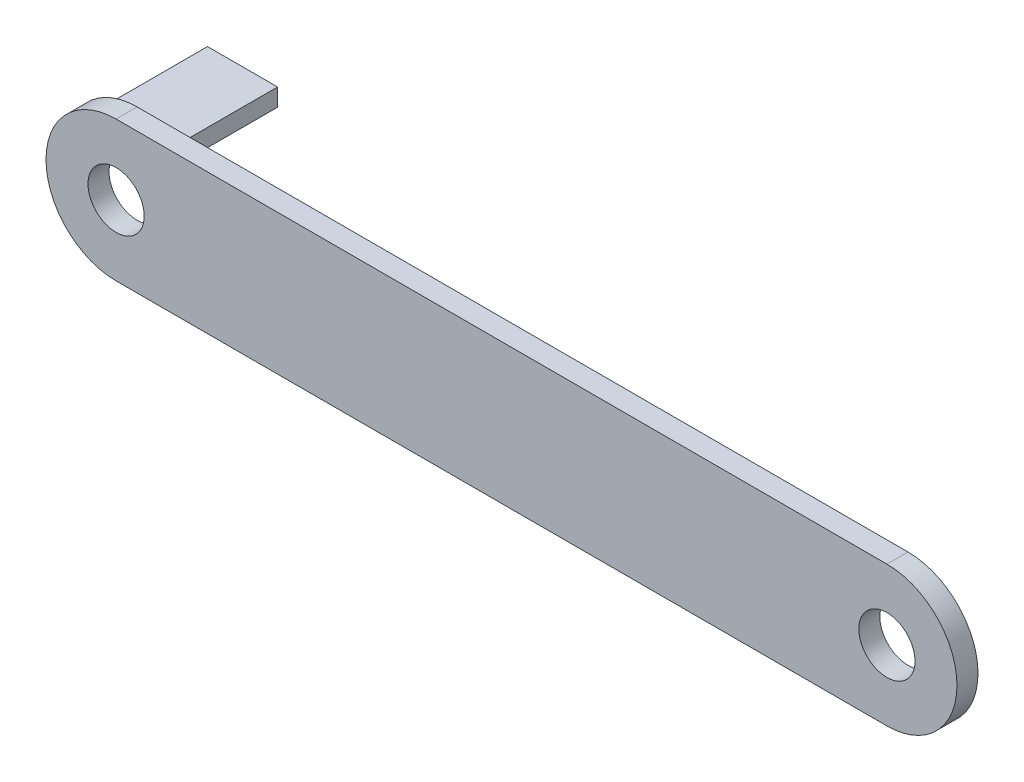
ISO-10303-21;
HEADER;
FILE_DESCRIPTION(('STEP AP214'),'2;1');
FILE_NAME('part.step','',(''),(''),'','','');
FILE_SCHEMA(('AUTOMOTIVE_DESIGN { 1 0 10303 214 1 1 1 1 }'));
ENDSEC;
DATA;
#1=APPLICATION_CONTEXT('core data for automotive mechanical design processes');
#2=APPLICATION_PROTOCOL_DEFINITION('international standard','automotive_design',2000,#1);
#3=PRODUCT_CONTEXT('',#1,'mechanical');
#4=PRODUCT('Part','Part','',(#3));
#5=PRODUCT_RELATED_PRODUCT_CATEGORY('part','',(#4));
#6=PRODUCT_DEFINITION_FORMATION('','',#4);
#7=PRODUCT_DEFINITION_CONTEXT('part definition',#1,'design');
#8=PRODUCT_DEFINITION('design','',#6,#7);
#9=PRODUCT_DEFINITION_SHAPE('','',#8);
#10=(LENGTH_UNIT() NAMED_UNIT(*) SI_UNIT(.MILLI.,.METRE.));
#11=(NAMED_UNIT(*) PLANE_ANGLE_UNIT() SI_UNIT($,.RADIAN.));
#12=(NAMED_UNIT(*) SI_UNIT($,.STERADIAN.) SOLID_ANGLE_UNIT());
#13=UNCERTAINTY_MEASURE_WITH_UNIT(LENGTH_MEASURE(1.E-05),#10,'distance_accuracy_value','');
#14=(GEOMETRIC_REPRESENTATION_CONTEXT(3) GLOBAL_UNCERTAINTY_ASSIGNED_CONTEXT((#13)) GLOBAL_UNIT_ASSIGNED_CONTEXT((#10,
#11,#12)) REPRESENTATION_CONTEXT('',''));
#15=CARTESIAN_POINT('',(0.,0.,0.));
#16=DIRECTION('',(0.,0.,1.));
#17=DIRECTION('',(1.,0.,0.));
#18=AXIS2_PLACEMENT_3D('',#15,#16,#17);
#19=CARTESIAN_POINT('',(0.,0.,3.));
#20=DIRECTION('',(0.,0.,-1.));
#21=DIRECTION('',(-1.,0.,0.));
#22=AXIS2_PLACEMENT_3D('',#19,#20,#21);
#23=CYLINDRICAL_SURFACE('',#22,10.);
#24=CARTESIAN_POINT('',(0.,0.,0.));
#25=DIRECTION('',(0.,0.,1.));
#26=DIRECTION('',(1.,0.,0.));
#27=AXIS2_PLACEMENT_3D('',#24,#25,#26);
#28=CIRCLE('',#27,10.);
#29=CARTESIAN_POINT('',(0.,10.,0.));
#30=VERTEX_POINT('',#29);
#31=CARTESIAN_POINT('',(0.,-10.,0.));
#32=VERTEX_POINT('',#31);
#33=EDGE_CURVE('E160',#30,#32,#28,.T.);
#34=ORIENTED_EDGE('',*,*,#33,.T.);
#35=DIRECTION('',(0.,0.,-1.));
#36=VECTOR('',#35,1.);
#37=CARTESIAN_POINT('',(0.,-10.,3.));
#38=LINE('',#37,#36);
#39=CARTESIAN_POINT('',(0.,-10.,3.));
#40=VERTEX_POINT('',#39);
#41=EDGE_CURVE('E43',#40,#32,#38,.T.);
#42=ORIENTED_EDGE('',*,*,#41,.F.);
#43=CARTESIAN_POINT('',(0.,0.,3.));
#44=DIRECTION('',(0.,0.,1.));
#45=DIRECTION('',(1.,0.,0.));
#46=AXIS2_PLACEMENT_3D('',#43,#44,#45);
#47=CIRCLE('',#46,10.);
#48=CARTESIAN_POINT('',(0.,10.,3.));
#49=VERTEX_POINT('',#48);
#50=EDGE_CURVE('E143',#49,#40,#47,.T.);
#51=ORIENTED_EDGE('',*,*,#50,.F.);
#52=DIRECTION('',(0.,0.,-1.));
#53=VECTOR('',#52,1.);
#54=CARTESIAN_POINT('',(0.,10.,3.));
#55=LINE('',#54,#53);
#56=EDGE_CURVE('E157',#49,#30,#55,.T.);
#57=ORIENTED_EDGE('',*,*,#56,.T.);
#58=EDGE_LOOP('',(#34,#42,#51,#57));
#59=FACE_BOUND('',#58,.T.);
#60=ADVANCED_FACE('F35',(#59),#23,.T.);
#61=CARTESIAN_POINT('',(0.,-10.,3.));
#62=DIRECTION('',(0.,1.,0.));
#63=DIRECTION('',(0.,0.,1.));
#64=AXIS2_PLACEMENT_3D('',#61,#62,#63);
#65=PLANE('',#64);
#66=DIRECTION('',(1.,0.,0.));
#67=VECTOR('',#66,1.);
#68=CARTESIAN_POINT('',(0.,-10.,0.));
#69=LINE('',#68,#67);
#70=CARTESIAN_POINT('',(110.,-10.0000000000639,0.));
#71=VERTEX_POINT('',#70);
#72=EDGE_CURVE('E163',#32,#71,#69,.T.);
#73=ORIENTED_EDGE('',*,*,#72,.T.);
#74=DIRECTION('',(0.,0.,-1.));
#75=VECTOR('',#74,1.);
#76=CARTESIAN_POINT('',(110.,-10.0000000000639,3.));
#77=LINE('',#76,#75);
#78=CARTESIAN_POINT('',(110.,-10.0000000000639,3.));
#79=VERTEX_POINT('',#78);
#80=EDGE_CURVE('E176',#79,#71,#77,.T.);
#81=ORIENTED_EDGE('',*,*,#80,.F.);
#82=DIRECTION('',(1.,0.,0.));
#83=VECTOR('',#82,1.);
#84=CARTESIAN_POINT('',(0.,-10.,3.));
#85=LINE('',#84,#83);
#86=EDGE_CURVE('E147',#40,#79,#85,.T.);
#87=ORIENTED_EDGE('',*,*,#86,.F.);
#88=ORIENTED_EDGE('',*,*,#41,.T.);
#89=EDGE_LOOP('',(#73,#81,#87,#88));
#90=FACE_BOUND('',#89,.T.);
#91=ADVANCED_FACE('F181',(#90),#65,.F.);
#92=CARTESIAN_POINT('',(110.,-6.38881308967498E-11,3.));
#93=DIRECTION('',(0.,0.,-1.));
#94=DIRECTION('',(-1.,0.,0.));
#95=AXIS2_PLACEMENT_3D('',#92,#93,#94);
#96=CYLINDRICAL_SURFACE('',#95,10.0000000000639);
#97=CARTESIAN_POINT('',(110.,-6.38881308967498E-11,0.));
#98=DIRECTION('',(0.,0.,1.));
#99=DIRECTION('',(1.,0.,0.));
#100=AXIS2_PLACEMENT_3D('',#97,#98,#99);
#101=CIRCLE('',#100,10.0000000000639);
#102=CARTESIAN_POINT('',(110.,10.,0.));
#103=VERTEX_POINT('',#102);
#104=EDGE_CURVE('E165',#71,#103,#101,.T.);
#105=ORIENTED_EDGE('',*,*,#104,.T.);
#106=DIRECTION('',(0.,0.,-1.));
#107=VECTOR('',#106,1.);
#108=CARTESIAN_POINT('',(110.,10.,3.));
#109=LINE('',#108,#107);
#110=CARTESIAN_POINT('',(110.,10.,3.));
#111=VERTEX_POINT('',#110);
#112=EDGE_CURVE('E174',#111,#103,#109,.T.);
#113=ORIENTED_EDGE('',*,*,#112,.F.);
#114=CARTESIAN_POINT('',(110.,-6.38881308967498E-11,3.));
#115=DIRECTION('',(0.,0.,1.));
#116=DIRECTION('',(1.,0.,0.));
#117=AXIS2_PLACEMENT_3D('',#114,#115,#116);
#118=CIRCLE('',#117,10.0000000000639);
#119=EDGE_CURVE('E149',#79,#111,#118,.T.);
#120=ORIENTED_EDGE('',*,*,#119,.F.);
#121=ORIENTED_EDGE('',*,*,#80,.T.);
#122=EDGE_LOOP('',(#105,#113,#120,#121));
#123=FACE_BOUND('',#122,.T.);
#124=ADVANCED_FACE('F197',(#123),#96,.T.);
#125=CARTESIAN_POINT('',(0.,10.,3.));
#126=DIRECTION('',(0.,1.,0.));
#127=DIRECTION('',(-1.,0.,0.));
#128=AXIS2_PLACEMENT_3D('',#125,#126,#127);
#129=PLANE('',#128);
#130=DIRECTION('',(1.,0.,0.));
#131=VECTOR('',#130,1.);
#132=CARTESIAN_POINT('',(0.,10.,0.));
#133=LINE('',#132,#131);
#134=EDGE_CURVE('E168',#30,#103,#133,.T.);
#135=ORIENTED_EDGE('',*,*,#134,.F.);
#136=ORIENTED_EDGE('',*,*,#56,.F.);
#137=DIRECTION('',(1.,0.,0.));
#138=VECTOR('',#137,1.);
#139=CARTESIAN_POINT('',(0.,10.,3.));
#140=LINE('',#139,#138);
#141=EDGE_CURVE('E151',#49,#111,#140,.T.);
#142=ORIENTED_EDGE('',*,*,#141,.T.);
#143=ORIENTED_EDGE('',*,*,#112,.T.);
#144=EDGE_LOOP('',(#135,#136,#142,#143));
#145=FACE_BOUND('',#144,.T.);
#146=ADVANCED_FACE('F192',(#145),#129,.T.);
#147=CARTESIAN_POINT('',(0.,0.,3.));
#148=DIRECTION('',(0.,0.,-1.));
#149=DIRECTION('',(-1.,0.,0.));
#150=AXIS2_PLACEMENT_3D('',#147,#148,#149);
#151=CYLINDRICAL_SURFACE('',#150,4.01);
#152=CARTESIAN_POINT('',(0.,0.,3.));
#153=DIRECTION('',(0.,0.,1.));
#154=DIRECTION('',(1.,0.,0.));
#155=AXIS2_PLACEMENT_3D('',#152,#153,#154);
#156=CIRCLE('',#155,4.01);
#157=CARTESIAN_POINT('',(4.01,0.,3.));
#158=VERTEX_POINT('',#157);
#159=EDGE_CURVE('E140',#158,#158,#156,.T.);
#160=ORIENTED_EDGE('',*,*,#159,.T.);
#161=EDGE_LOOP('',(#160));
#162=FACE_BOUND('',#161,.T.);
#163=CARTESIAN_POINT('',(0.,0.,0.));
#164=DIRECTION('',(0.,0.,1.));
#165=DIRECTION('',(1.,0.,0.));
#166=AXIS2_PLACEMENT_3D('',#163,#164,#165);
#167=CIRCLE('',#166,4.01);
#168=CARTESIAN_POINT('',(4.01,0.,0.));
#169=VERTEX_POINT('',#168);
#170=EDGE_CURVE('E139',#169,#169,#167,.T.);
#171=ORIENTED_EDGE('',*,*,#170,.F.);
#172=EDGE_LOOP('',(#171));
#173=FACE_BOUND('',#172,.T.);
#174=ADVANCED_FACE('F37',(#162,#173),#151,.F.);
#175=CARTESIAN_POINT('',(110.,-6.38881308967498E-11,3.));
#176=DIRECTION('',(0.,0.,-1.));
#177=DIRECTION('',(-1.,0.,0.));
#178=AXIS2_PLACEMENT_3D('',#175,#176,#177);
#179=CYLINDRICAL_SURFACE('',#178,4.01);
#180=CARTESIAN_POINT('',(110.,-6.38881308967498E-11,3.));
#181=DIRECTION('',(0.,0.,1.));
#182=DIRECTION('',(1.,0.,0.));
#183=AXIS2_PLACEMENT_3D('',#180,#181,#182);
#184=CIRCLE('',#183,4.01);
#185=CARTESIAN_POINT('',(114.01,-6.38881308967498E-11,3.));
#186=VERTEX_POINT('',#185);
#187=EDGE_CURVE('E154',#186,#186,#184,.T.);
#188=ORIENTED_EDGE('',*,*,#187,.T.);
#189=EDGE_LOOP('',(#188));
#190=FACE_BOUND('',#189,.T.);
#191=CARTESIAN_POINT('',(110.,-6.38881308967498E-11,0.));
#192=DIRECTION('',(0.,0.,1.));
#193=DIRECTION('',(1.,0.,0.));
#194=AXIS2_PLACEMENT_3D('',#191,#192,#193);
#195=CIRCLE('',#194,4.01);
#196=CARTESIAN_POINT('',(114.01,-6.38881308967498E-11,0.));
#197=VERTEX_POINT('',#196);
#198=EDGE_CURVE('E144',#197,#197,#195,.T.);
#199=ORIENTED_EDGE('',*,*,#198,.F.);
#200=EDGE_LOOP('',(#199));
#201=FACE_BOUND('',#200,.T.);
#202=ADVANCED_FACE('F202',(#190,#201),#179,.F.);
#203=CARTESIAN_POINT('',(0.,0.,3.));
#204=DIRECTION('',(0.,0.,1.));
#205=DIRECTION('',(1.,0.,0.));
#206=AXIS2_PLACEMENT_3D('',#203,#204,#205);
#207=PLANE('',#206);
#208=ORIENTED_EDGE('',*,*,#159,.F.);
#209=EDGE_LOOP('',(#208));
#210=FACE_BOUND('',#209,.T.);
#211=ORIENTED_EDGE('',*,*,#50,.T.);
#212=ORIENTED_EDGE('',*,*,#86,.T.);
#213=ORIENTED_EDGE('',*,*,#119,.T.);
#214=ORIENTED_EDGE('',*,*,#141,.F.);
#215=EDGE_LOOP('',(#211,#212,#213,#214));
#216=FACE_BOUND('',#215,.T.);
#217=ORIENTED_EDGE('',*,*,#187,.F.);
#218=EDGE_LOOP('',(#217));
#219=FACE_BOUND('',#218,.T.);
#220=ADVANCED_FACE('F199',(#210,#216,#219),#207,.T.);
#221=CARTESIAN_POINT('',(0.,0.,0.));
#222=DIRECTION('',(0.,0.,1.));
#223=DIRECTION('',(1.,0.,0.));
#224=AXIS2_PLACEMENT_3D('',#221,#222,#223);
#225=PLANE('',#224);
#226=DIRECTION('',(1.,0.,0.));
#227=VECTOR('',#226,1.);
#228=CARTESIAN_POINT('',(0.,4.98516197188792,0.));
#229=LINE('',#228,#227);
#230=CARTESIAN_POINT('',(-4.9531105439371,4.98516197188793,0.));
#231=VERTEX_POINT('',#230);
#232=CARTESIAN_POINT('',(5.04688945606289,4.98516197188792,0.));
#233=VERTEX_POINT('',#232);
#234=EDGE_CURVE('E50',#231,#233,#229,.T.);
#235=ORIENTED_EDGE('',*,*,#234,.T.);
#236=DIRECTION('',(0.,1.,0.));
#237=VECTOR('',#236,1.);
#238=CARTESIAN_POINT('',(5.04688945606289,0.,0.));
#239=LINE('',#238,#237);
#240=CARTESIAN_POINT('',(5.04688945606289,7.48516197188791,0.));
#241=VERTEX_POINT('',#240);
#242=EDGE_CURVE('E104',#233,#241,#239,.T.);
#243=ORIENTED_EDGE('',*,*,#242,.T.);
#244=DIRECTION('',(1.,0.,0.));
#245=VECTOR('',#244,1.);
#246=CARTESIAN_POINT('',(0.,7.48516197188793,0.));
#247=LINE('',#246,#245);
#248=CARTESIAN_POINT('',(-4.9531105439371,7.48516197188793,0.));
#249=VERTEX_POINT('',#248);
#250=EDGE_CURVE('E117',#249,#241,#247,.T.);
#251=ORIENTED_EDGE('',*,*,#250,.F.);
#252=DIRECTION('',(0.,1.,0.));
#253=VECTOR('',#252,1.);
#254=CARTESIAN_POINT('',(-4.9531105439371,0.,0.));
#255=LINE('',#254,#253);
#256=EDGE_CURVE('E55',#231,#249,#255,.T.);
#257=ORIENTED_EDGE('',*,*,#256,.F.);
#258=EDGE_LOOP('',(#235,#243,#251,#257));
#259=FACE_BOUND('',#258,.T.);
#260=CARTESIAN_POINT('',(20.,0.,0.));
#261=DIRECTION('',(0.,0.,1.));
#262=DIRECTION('',(1.,0.,0.));
#263=AXIS2_PLACEMENT_3D('',#260,#261,#262);
#264=CIRCLE('',#263,1.49);
#265=CARTESIAN_POINT('',(21.49,0.,0.));
#266=VERTEX_POINT('',#265);
#267=EDGE_CURVE('E11',#266,#266,#264,.F.);
#268=ORIENTED_EDGE('',*,*,#267,.F.);
#269=EDGE_LOOP('',(#268));
#270=FACE_BOUND('',#269,.T.);
#271=ORIENTED_EDGE('',*,*,#170,.T.);
#272=EDGE_LOOP('',(#271));
#273=FACE_BOUND('',#272,.T.);
#274=ORIENTED_EDGE('',*,*,#33,.F.);
#275=ORIENTED_EDGE('',*,*,#134,.T.);
#276=ORIENTED_EDGE('',*,*,#104,.F.);
#277=ORIENTED_EDGE('',*,*,#72,.F.);
#278=EDGE_LOOP('',(#274,#275,#276,#277));
#279=FACE_BOUND('',#278,.T.);
#280=ORIENTED_EDGE('',*,*,#198,.T.);
#281=EDGE_LOOP('',(#280));
#282=FACE_BOUND('',#281,.T.);
#283=ADVANCED_FACE('F188',(#259,#270,#273,#279,#282),#225,.F.);
#284=CARTESIAN_POINT('',(20.,0.,-4.));
#285=DIRECTION('',(0.,0.,1.));
#286=DIRECTION('',(1.,0.,0.));
#287=AXIS2_PLACEMENT_3D('',#284,#285,#286);
#288=CYLINDRICAL_SURFACE('',#287,1.49);
#289=CARTESIAN_POINT('',(20.,0.,-4.));
#290=DIRECTION('',(0.,0.,-1.));
#291=DIRECTION('',(-1.,0.,0.));
#292=AXIS2_PLACEMENT_3D('',#289,#290,#291);
#293=CIRCLE('',#292,1.49);
#294=CARTESIAN_POINT('',(18.51,0.,-4.));
#295=VERTEX_POINT('',#294);
#296=EDGE_CURVE('E107',#295,#295,#293,.T.);
#297=ORIENTED_EDGE('',*,*,#296,.F.);
#298=EDGE_LOOP('',(#297));
#299=FACE_BOUND('',#298,.T.);
#300=ORIENTED_EDGE('',*,*,#267,.T.);
#301=EDGE_LOOP('',(#300));
#302=FACE_BOUND('',#301,.T.);
#303=ADVANCED_FACE('F212',(#299,#302),#288,.T.);
#304=CARTESIAN_POINT('',(20.,0.,-4.));
#305=DIRECTION('',(0.,0.,-1.));
#306=DIRECTION('',(-1.,0.,0.));
#307=AXIS2_PLACEMENT_3D('',#304,#305,#306);
#308=PLANE('',#307);
#309=ORIENTED_EDGE('',*,*,#296,.T.);
#310=EDGE_LOOP('',(#309));
#311=FACE_BOUND('',#310,.T.);
#312=ADVANCED_FACE('F217',(#311),#308,.T.);
#313=CARTESIAN_POINT('',(5.04688945606289,0.,-15.));
#314=DIRECTION('',(1.,0.,0.));
#315=DIRECTION('',(0.,0.,-1.));
#316=AXIS2_PLACEMENT_3D('',#313,#314,#315);
#317=PLANE('',#316);
#318=ORIENTED_EDGE('',*,*,#242,.F.);
#319=DIRECTION('',(0.,0.,1.));
#320=VECTOR('',#319,1.);
#321=CARTESIAN_POINT('',(5.04688945606289,4.98516197188792,-15.));
#322=LINE('',#321,#320);
#323=CARTESIAN_POINT('',(5.04688945606289,4.98516197188792,-15.));
#324=VERTEX_POINT('',#323);
#325=EDGE_CURVE('E99',#324,#233,#322,.T.);
#326=ORIENTED_EDGE('',*,*,#325,.F.);
#327=DIRECTION('',(0.,1.,0.));
#328=VECTOR('',#327,1.);
#329=CARTESIAN_POINT('',(5.04688945606289,0.,-15.));
#330=LINE('',#329,#328);
#331=CARTESIAN_POINT('',(5.04688945606289,7.48516197188791,-15.));
#332=VERTEX_POINT('',#331);
#333=EDGE_CURVE('E103',#324,#332,#330,.T.);
#334=ORIENTED_EDGE('',*,*,#333,.T.);
#335=DIRECTION('',(0.,0.,1.));
#336=VECTOR('',#335,1.);
#337=CARTESIAN_POINT('',(5.04688945606289,7.48516197188791,-15.));
#338=LINE('',#337,#336);
#339=EDGE_CURVE('E126',#332,#241,#338,.T.);
#340=ORIENTED_EDGE('',*,*,#339,.T.);
#341=EDGE_LOOP('',(#318,#326,#334,#340));
#342=FACE_BOUND('',#341,.T.);
#343=ADVANCED_FACE('F101',(#342),#317,.T.);
#344=CARTESIAN_POINT('',(0.,4.98516197188792,-15.));
#345=DIRECTION('',(0.,-1.,0.));
#346=DIRECTION('',(1.,0.,0.));
#347=AXIS2_PLACEMENT_3D('',#344,#345,#346);
#348=PLANE('',#347);
#349=ORIENTED_EDGE('',*,*,#234,.F.);
#350=DIRECTION('',(0.,0.,1.));
#351=VECTOR('',#350,1.);
#352=CARTESIAN_POINT('',(-4.9531105439371,4.98516197188793,-15.));
#353=LINE('',#352,#351);
#354=CARTESIAN_POINT('',(-4.9531105439371,4.98516197188793,-15.));
#355=VERTEX_POINT('',#354);
#356=EDGE_CURVE('E108',#355,#231,#353,.T.);
#357=ORIENTED_EDGE('',*,*,#356,.F.);
#358=DIRECTION('',(1.,0.,0.));
#359=VECTOR('',#358,1.);
#360=CARTESIAN_POINT('',(0.,4.98516197188792,-15.));
#361=LINE('',#360,#359);
#362=EDGE_CURVE('E113',#355,#324,#361,.T.);
#363=ORIENTED_EDGE('',*,*,#362,.T.);
#364=ORIENTED_EDGE('',*,*,#325,.T.);
#365=EDGE_LOOP('',(#349,#357,#363,#364));
#366=FACE_BOUND('',#365,.T.);
#367=ADVANCED_FACE('F119',(#366),#348,.T.);
#368=CARTESIAN_POINT('',(-4.9531105439371,0.,-15.));
#369=DIRECTION('',(1.,0.,0.));
#370=DIRECTION('',(0.,0.,-1.));
#371=AXIS2_PLACEMENT_3D('',#368,#369,#370);
#372=PLANE('',#371);
#373=ORIENTED_EDGE('',*,*,#256,.T.);
#374=DIRECTION('',(0.,0.,1.));
#375=VECTOR('',#374,1.);
#376=CARTESIAN_POINT('',(-4.9531105439371,7.48516197188793,-15.));
#377=LINE('',#376,#375);
#378=CARTESIAN_POINT('',(-4.9531105439371,7.48516197188793,-15.));
#379=VERTEX_POINT('',#378);
#380=EDGE_CURVE('E133',#379,#249,#377,.T.);
#381=ORIENTED_EDGE('',*,*,#380,.F.);
#382=DIRECTION('',(0.,1.,0.));
#383=VECTOR('',#382,1.);
#384=CARTESIAN_POINT('',(-4.9531105439371,0.,-15.));
#385=LINE('',#384,#383);
#386=EDGE_CURVE('E121',#355,#379,#385,.T.);
#387=ORIENTED_EDGE('',*,*,#386,.F.);
#388=ORIENTED_EDGE('',*,*,#356,.T.);
#389=EDGE_LOOP('',(#373,#381,#387,#388));
#390=FACE_BOUND('',#389,.T.);
#391=ADVANCED_FACE('F288',(#390),#372,.F.);
#392=CARTESIAN_POINT('',(0.,7.48516197188793,-15.));
#393=DIRECTION('',(0.,-1.,0.));
#394=DIRECTION('',(0.,0.,-1.));
#395=AXIS2_PLACEMENT_3D('',#392,#393,#394);
#396=PLANE('',#395);
#397=ORIENTED_EDGE('',*,*,#250,.T.);
#398=ORIENTED_EDGE('',*,*,#339,.F.);
#399=DIRECTION('',(1.,0.,0.));
#400=VECTOR('',#399,1.);
#401=CARTESIAN_POINT('',(0.,7.48516197188793,-15.));
#402=LINE('',#401,#400);
#403=EDGE_CURVE('E115',#379,#332,#402,.T.);
#404=ORIENTED_EDGE('',*,*,#403,.F.);
#405=ORIENTED_EDGE('',*,*,#380,.T.);
#406=EDGE_LOOP('',(#397,#398,#404,#405));
#407=FACE_BOUND('',#406,.T.);
#408=ADVANCED_FACE('F297',(#407),#396,.F.);
#409=CARTESIAN_POINT('',(0.,0.,-15.));
#410=DIRECTION('',(0.,0.,-0.999999999999989));
#411=DIRECTION('',(-1.,0.,0.));
#412=AXIS2_PLACEMENT_3D('',#409,#410,#411);
#413=PLANE('',#412);
#414=ORIENTED_EDGE('',*,*,#333,.F.);
#415=ORIENTED_EDGE('',*,*,#362,.F.);
#416=ORIENTED_EDGE('',*,*,#386,.T.);
#417=ORIENTED_EDGE('',*,*,#403,.T.);
#418=EDGE_LOOP('',(#414,#415,#416,#417));
#419=FACE_BOUND('',#418,.T.);
#420=ADVANCED_FACE('F112',(#419),#413,.T.);
#421=CLOSED_SHELL('',(#60,#91,#124,#146,#174,#202,#220,#283,#303,#312,#343,#367,#391,#408,#420));
#422=MANIFOLD_SOLID_BREP('B2',#421);
#423=ADVANCED_BREP_SHAPE_REPRESENTATION('',(#18,#422),#14);
#424=SHAPE_DEFINITION_REPRESENTATION(#9,#423);
ENDSEC;
END-ISO-10303-21;
